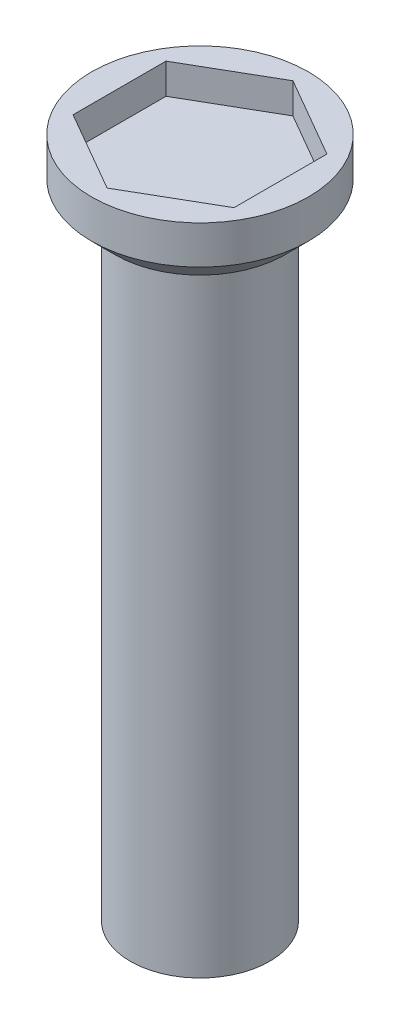
ISO-10303-21;
HEADER;
FILE_DESCRIPTION(('STEP AP214'),'2;1');
FILE_NAME('part.step','',(''),(''),'','','');
FILE_SCHEMA(('AUTOMOTIVE_DESIGN { 1 0 10303 214 1 1 1 1 }'));
ENDSEC;
DATA;
#1=APPLICATION_CONTEXT('core data for automotive mechanical design processes');
#2=APPLICATION_PROTOCOL_DEFINITION('international standard','automotive_design',2000,#1);
#3=PRODUCT_CONTEXT('',#1,'mechanical');
#4=PRODUCT('Part','Part','',(#3));
#5=PRODUCT_RELATED_PRODUCT_CATEGORY('part','',(#4));
#6=PRODUCT_DEFINITION_FORMATION('','',#4);
#7=PRODUCT_DEFINITION_CONTEXT('part definition',#1,'design');
#8=PRODUCT_DEFINITION('design','',#6,#7);
#9=PRODUCT_DEFINITION_SHAPE('','',#8);
#10=(LENGTH_UNIT() NAMED_UNIT(*) SI_UNIT(.MILLI.,.METRE.));
#11=(NAMED_UNIT(*) PLANE_ANGLE_UNIT() SI_UNIT($,.RADIAN.));
#12=(NAMED_UNIT(*) SI_UNIT($,.STERADIAN.) SOLID_ANGLE_UNIT());
#13=UNCERTAINTY_MEASURE_WITH_UNIT(LENGTH_MEASURE(1.E-05),#10,'distance_accuracy_value','');
#14=(GEOMETRIC_REPRESENTATION_CONTEXT(3) GLOBAL_UNCERTAINTY_ASSIGNED_CONTEXT((#13)) GLOBAL_UNIT_ASSIGNED_CONTEXT((#10,
#11,#12)) REPRESENTATION_CONTEXT('',''));
#15=CARTESIAN_POINT('',(0.,0.,0.));
#16=DIRECTION('',(0.,0.,1.));
#17=DIRECTION('',(1.,0.,0.));
#18=AXIS2_PLACEMENT_3D('',#15,#16,#17);
#19=CARTESIAN_POINT('',(0.,20.,0.));
#20=DIRECTION('',(0.,-1.,0.));
#21=DIRECTION('',(0.,0.,-1.));
#22=AXIS2_PLACEMENT_3D('',#19,#20,#21);
#23=CYLINDRICAL_SURFACE('',#22,2.25);
#24=CARTESIAN_POINT('',(0.,20.,0.));
#25=DIRECTION('',(0.,1.,0.));
#26=DIRECTION('',(0.,0.,1.));
#27=AXIS2_PLACEMENT_3D('',#24,#25,#26);
#28=CIRCLE('',#27,2.25);
#29=CARTESIAN_POINT('',(0.,20.,2.25));
#30=VERTEX_POINT('',#29);
#31=EDGE_CURVE('E153',#30,#30,#28,.T.);
#32=ORIENTED_EDGE('',*,*,#31,.F.);
#33=EDGE_LOOP('',(#32));
#34=FACE_BOUND('',#33,.T.);
#35=CARTESIAN_POINT('',(0.,0.,0.));
#36=DIRECTION('',(0.,1.,0.));
#37=DIRECTION('',(0.,0.,1.));
#38=AXIS2_PLACEMENT_3D('',#35,#36,#37);
#39=CIRCLE('',#38,2.25);
#40=CARTESIAN_POINT('',(0.,0.,2.25));
#41=VERTEX_POINT('',#40);
#42=EDGE_CURVE('E152',#41,#41,#39,.T.);
#43=ORIENTED_EDGE('',*,*,#42,.T.);
#44=EDGE_LOOP('',(#43));
#45=FACE_BOUND('',#44,.T.);
#46=ADVANCED_FACE('F41',(#34,#45),#23,.T.);
#47=CARTESIAN_POINT('',(0.,0.,0.));
#48=DIRECTION('',(0.,1.,0.));
#49=DIRECTION('',(0.,0.,1.));
#50=AXIS2_PLACEMENT_3D('',#47,#48,#49);
#51=PLANE('',#50);
#52=ORIENTED_EDGE('',*,*,#42,.F.);
#53=EDGE_LOOP('',(#52));
#54=FACE_BOUND('',#53,.T.);
#55=ADVANCED_FACE('F179',(#54),#51,.F.);
#56=CARTESIAN_POINT('',(0.,22.,0.));
#57=DIRECTION('',(0.,-1.,0.));
#58=DIRECTION('',(0.,0.,-1.));
#59=AXIS2_PLACEMENT_3D('',#56,#57,#58);
#60=CYLINDRICAL_SURFACE('',#59,3.5);
#61=CARTESIAN_POINT('',(0.,20.762,0.));
#62=DIRECTION('',(0.,1.,0.));
#63=DIRECTION('',(0.,0.,1.));
#64=AXIS2_PLACEMENT_3D('',#61,#62,#63);
#65=CIRCLE('',#64,3.5);
#66=CARTESIAN_POINT('',(0.,20.762,3.5));
#67=VERTEX_POINT('',#66);
#68=EDGE_CURVE('E50',#67,#67,#65,.T.);
#69=ORIENTED_EDGE('',*,*,#68,.T.);
#70=EDGE_LOOP('',(#69));
#71=FACE_BOUND('',#70,.T.);
#72=CARTESIAN_POINT('',(0.,22.,0.));
#73=DIRECTION('',(0.,1.,0.));
#74=DIRECTION('',(0.,0.,1.));
#75=AXIS2_PLACEMENT_3D('',#72,#73,#74);
#76=CIRCLE('',#75,3.5);
#77=CARTESIAN_POINT('',(0.,22.,3.5));
#78=VERTEX_POINT('',#77);
#79=EDGE_CURVE('E144',#78,#78,#76,.T.);
#80=ORIENTED_EDGE('',*,*,#79,.F.);
#81=EDGE_LOOP('',(#80));
#82=FACE_BOUND('',#81,.T.);
#83=ADVANCED_FACE('F160',(#71,#82),#60,.T.);
#84=CARTESIAN_POINT('',(0.,22.,0.));
#85=DIRECTION('',(0.,1.,0.));
#86=DIRECTION('',(0.,0.,1.));
#87=AXIS2_PLACEMENT_3D('',#84,#85,#86);
#88=PLANE('',#87);
#89=DIRECTION('',(-0.866025403784439,0.,-0.5));
#90=VECTOR('',#89,1.);
#91=CARTESIAN_POINT('',(2.59807621135332,22.,-1.5));
#92=LINE('',#91,#90);
#93=CARTESIAN_POINT('',(2.59807621135332,22.,-1.5));
#94=VERTEX_POINT('',#93);
#95=CARTESIAN_POINT('',(0.,22.,-3.));
#96=VERTEX_POINT('',#95);
#97=EDGE_CURVE('E57',#94,#96,#92,.T.);
#98=ORIENTED_EDGE('',*,*,#97,.F.);
#99=DIRECTION('',(0.,0.,-1.));
#100=VECTOR('',#99,1.);
#101=CARTESIAN_POINT('',(2.59807621135332,22.,1.5));
#102=LINE('',#101,#100);
#103=CARTESIAN_POINT('',(2.59807621135332,22.,1.5));
#104=VERTEX_POINT('',#103);
#105=EDGE_CURVE('E140',#104,#94,#102,.T.);
#106=ORIENTED_EDGE('',*,*,#105,.F.);
#107=DIRECTION('',(0.866025403784439,0.,-0.5));
#108=VECTOR('',#107,1.);
#109=CARTESIAN_POINT('',(0.,22.,3.));
#110=LINE('',#109,#108);
#111=CARTESIAN_POINT('',(0.,22.,3.));
#112=VERTEX_POINT('',#111);
#113=EDGE_CURVE('E138',#112,#104,#110,.T.);
#114=ORIENTED_EDGE('',*,*,#113,.F.);
#115=DIRECTION('',(0.866025403784439,0.,0.5));
#116=VECTOR('',#115,1.);
#117=CARTESIAN_POINT('',(-2.59807621135332,22.,1.5));
#118=LINE('',#117,#116);
#119=CARTESIAN_POINT('',(-2.59807621135332,22.,1.5));
#120=VERTEX_POINT('',#119);
#121=EDGE_CURVE('E105',#120,#112,#118,.T.);
#122=ORIENTED_EDGE('',*,*,#121,.F.);
#123=DIRECTION('',(0.,0.,1.));
#124=VECTOR('',#123,1.);
#125=CARTESIAN_POINT('',(-2.59807621135332,22.,-1.5));
#126=LINE('',#125,#124);
#127=CARTESIAN_POINT('',(-2.59807621135332,22.,-1.5));
#128=VERTEX_POINT('',#127);
#129=EDGE_CURVE('E134',#128,#120,#126,.T.);
#130=ORIENTED_EDGE('',*,*,#129,.F.);
#131=DIRECTION('',(-0.866025403784439,0.,0.5));
#132=VECTOR('',#131,1.);
#133=CARTESIAN_POINT('',(0.,22.,-3.));
#134=LINE('',#133,#132);
#135=EDGE_CURVE('E131',#96,#128,#134,.T.);
#136=ORIENTED_EDGE('',*,*,#135,.F.);
#137=EDGE_LOOP('',(#98,#106,#114,#122,#130,#136));
#138=FACE_BOUND('',#137,.T.);
#139=ORIENTED_EDGE('',*,*,#79,.T.);
#140=EDGE_LOOP('',(#139));
#141=FACE_BOUND('',#140,.T.);
#142=ADVANCED_FACE('F174',(#138,#141),#88,.T.);
#143=CARTESIAN_POINT('',(0.,20.,0.));
#144=DIRECTION('',(0.,1.,0.));
#145=DIRECTION('',(0.,0.,1.));
#146=AXIS2_PLACEMENT_3D('',#143,#144,#145);
#147=PLANE('',#146);
#148=CARTESIAN_POINT('',(0.,20.,0.));
#149=DIRECTION('',(0.,1.,0.));
#150=DIRECTION('',(0.,0.,1.));
#151=AXIS2_PLACEMENT_3D('',#148,#149,#150);
#152=CIRCLE('',#151,2.738);
#153=CARTESIAN_POINT('',(0.,20.,2.738));
#154=VERTEX_POINT('',#153);
#155=EDGE_CURVE('E11',#154,#154,#152,.F.);
#156=ORIENTED_EDGE('',*,*,#155,.T.);
#157=EDGE_LOOP('',(#156));
#158=FACE_BOUND('',#157,.T.);
#159=ORIENTED_EDGE('',*,*,#31,.T.);
#160=EDGE_LOOP('',(#159));
#161=FACE_BOUND('',#160,.T.);
#162=ADVANCED_FACE('F165',(#158,#161),#147,.F.);
#163=CARTESIAN_POINT('',(0.,20.762,0.));
#164=DIRECTION('',(0.,1.,0.));
#165=DIRECTION('',(0.,0.,1.));
#166=AXIS2_PLACEMENT_3D('',#163,#164,#165);
#167=CONICAL_SURFACE('',#166,3.5,0.785398163397448);
#168=ORIENTED_EDGE('',*,*,#155,.F.);
#169=EDGE_LOOP('',(#168));
#170=FACE_BOUND('',#169,.T.);
#171=ORIENTED_EDGE('',*,*,#68,.F.);
#172=EDGE_LOOP('',(#171));
#173=FACE_BOUND('',#172,.T.);
#174=ADVANCED_FACE('F44',(#170,#173),#167,.T.);
#175=CARTESIAN_POINT('',(2.59807621135332,21.016,-1.5));
#176=DIRECTION('',(0.5,0.,-0.866025403784439));
#177=DIRECTION('',(-0.866025403784439,0.,-0.5));
#178=AXIS2_PLACEMENT_3D('',#175,#176,#177);
#179=PLANE('',#178);
#180=ORIENTED_EDGE('',*,*,#97,.T.);
#181=DIRECTION('',(0.,1.,0.));
#182=VECTOR('',#181,1.);
#183=CARTESIAN_POINT('',(0.,21.016,-3.));
#184=LINE('',#183,#182);
#185=CARTESIAN_POINT('',(0.,21.016,-3.));
#186=VERTEX_POINT('',#185);
#187=EDGE_CURVE('E87',#186,#96,#184,.T.);
#188=ORIENTED_EDGE('',*,*,#187,.F.);
#189=DIRECTION('',(-0.866025403784439,0.,-0.5));
#190=VECTOR('',#189,1.);
#191=CARTESIAN_POINT('',(2.59807621135332,21.016,-1.5));
#192=LINE('',#191,#190);
#193=CARTESIAN_POINT('',(2.59807621135332,21.016,-1.5));
#194=VERTEX_POINT('',#193);
#195=EDGE_CURVE('E142',#194,#186,#192,.T.);
#196=ORIENTED_EDGE('',*,*,#195,.F.);
#197=DIRECTION('',(0.,1.,0.));
#198=VECTOR('',#197,1.);
#199=CARTESIAN_POINT('',(2.59807621135332,21.016,-1.5));
#200=LINE('',#199,#198);
#201=EDGE_CURVE('E65',#194,#94,#200,.T.);
#202=ORIENTED_EDGE('',*,*,#201,.T.);
#203=EDGE_LOOP('',(#180,#188,#196,#202));
#204=FACE_BOUND('',#203,.T.);
#205=ADVANCED_FACE('F164',(#204),#179,.F.);
#206=CARTESIAN_POINT('',(2.59807621135332,21.016,1.5));
#207=DIRECTION('',(1.,0.,0.));
#208=DIRECTION('',(0.,0.,-1.));
#209=AXIS2_PLACEMENT_3D('',#206,#207,#208);
#210=PLANE('',#209);
#211=ORIENTED_EDGE('',*,*,#105,.T.);
#212=ORIENTED_EDGE('',*,*,#201,.F.);
#213=DIRECTION('',(0.,0.,-1.));
#214=VECTOR('',#213,1.);
#215=CARTESIAN_POINT('',(2.59807621135332,21.016,1.5));
#216=LINE('',#215,#214);
#217=CARTESIAN_POINT('',(2.59807621135332,21.016,1.5));
#218=VERTEX_POINT('',#217);
#219=EDGE_CURVE('E117',#218,#194,#216,.T.);
#220=ORIENTED_EDGE('',*,*,#219,.F.);
#221=DIRECTION('',(0.,1.,0.));
#222=VECTOR('',#221,1.);
#223=CARTESIAN_POINT('',(2.59807621135332,21.016,1.5));
#224=LINE('',#223,#222);
#225=EDGE_CURVE('E109',#218,#104,#224,.T.);
#226=ORIENTED_EDGE('',*,*,#225,.T.);
#227=EDGE_LOOP('',(#211,#212,#220,#226));
#228=FACE_BOUND('',#227,.T.);
#229=ADVANCED_FACE('F172',(#228),#210,.F.);
#230=CARTESIAN_POINT('',(0.,21.016,3.));
#231=DIRECTION('',(0.5,0.,0.866025403784438));
#232=DIRECTION('',(0.866025403784439,0.,-0.5));
#233=AXIS2_PLACEMENT_3D('',#230,#231,#232);
#234=PLANE('',#233);
#235=ORIENTED_EDGE('',*,*,#113,.T.);
#236=ORIENTED_EDGE('',*,*,#225,.F.);
#237=DIRECTION('',(0.866025403784439,0.,-0.5));
#238=VECTOR('',#237,1.);
#239=CARTESIAN_POINT('',(0.,21.016,3.));
#240=LINE('',#239,#238);
#241=CARTESIAN_POINT('',(0.,21.016,3.));
#242=VERTEX_POINT('',#241);
#243=EDGE_CURVE('E113',#242,#218,#240,.T.);
#244=ORIENTED_EDGE('',*,*,#243,.F.);
#245=DIRECTION('',(0.,1.,0.));
#246=VECTOR('',#245,1.);
#247=CARTESIAN_POINT('',(0.,21.016,3.));
#248=LINE('',#247,#246);
#249=EDGE_CURVE('E98',#242,#112,#248,.T.);
#250=ORIENTED_EDGE('',*,*,#249,.T.);
#251=EDGE_LOOP('',(#235,#236,#244,#250));
#252=FACE_BOUND('',#251,.T.);
#253=ADVANCED_FACE('F114',(#252),#234,.F.);
#254=CARTESIAN_POINT('',(-2.59807621135332,21.016,1.5));
#255=DIRECTION('',(-0.5,0.,0.866025403784439));
#256=DIRECTION('',(0.866025403784439,0.,0.5));
#257=AXIS2_PLACEMENT_3D('',#254,#255,#256);
#258=PLANE('',#257);
#259=ORIENTED_EDGE('',*,*,#121,.T.);
#260=ORIENTED_EDGE('',*,*,#249,.F.);
#261=DIRECTION('',(0.866025403784439,0.,0.5));
#262=VECTOR('',#261,1.);
#263=CARTESIAN_POINT('',(-2.59807621135332,21.016,1.5));
#264=LINE('',#263,#262);
#265=CARTESIAN_POINT('',(-2.59807621135332,21.016,1.5));
#266=VERTEX_POINT('',#265);
#267=EDGE_CURVE('E102',#266,#242,#264,.T.);
#268=ORIENTED_EDGE('',*,*,#267,.F.);
#269=DIRECTION('',(0.,1.,0.));
#270=VECTOR('',#269,1.);
#271=CARTESIAN_POINT('',(-2.59807621135332,21.016,1.5));
#272=LINE('',#271,#270);
#273=EDGE_CURVE('E110',#266,#120,#272,.T.);
#274=ORIENTED_EDGE('',*,*,#273,.T.);
#275=EDGE_LOOP('',(#259,#260,#268,#274));
#276=FACE_BOUND('',#275,.T.);
#277=ADVANCED_FACE('F100',(#276),#258,.F.);
#278=CARTESIAN_POINT('',(-2.59807621135332,21.016,-1.5));
#279=DIRECTION('',(-1.,0.,0.));
#280=DIRECTION('',(0.,0.,1.));
#281=AXIS2_PLACEMENT_3D('',#278,#279,#280);
#282=PLANE('',#281);
#283=ORIENTED_EDGE('',*,*,#129,.T.);
#284=ORIENTED_EDGE('',*,*,#273,.F.);
#285=DIRECTION('',(0.,0.,1.));
#286=VECTOR('',#285,1.);
#287=CARTESIAN_POINT('',(-2.59807621135332,21.016,-1.5));
#288=LINE('',#287,#286);
#289=CARTESIAN_POINT('',(-2.59807621135332,21.016,-1.5));
#290=VERTEX_POINT('',#289);
#291=EDGE_CURVE('E123',#290,#266,#288,.T.);
#292=ORIENTED_EDGE('',*,*,#291,.F.);
#293=DIRECTION('',(0.,1.,0.));
#294=VECTOR('',#293,1.);
#295=CARTESIAN_POINT('',(-2.59807621135332,21.016,-1.5));
#296=LINE('',#295,#294);
#297=EDGE_CURVE('E147',#290,#128,#296,.T.);
#298=ORIENTED_EDGE('',*,*,#297,.T.);
#299=EDGE_LOOP('',(#283,#284,#292,#298));
#300=FACE_BOUND('',#299,.T.);
#301=ADVANCED_FACE('F196',(#300),#282,.F.);
#302=CARTESIAN_POINT('',(0.,21.016,-3.));
#303=DIRECTION('',(-0.5,0.,-0.866025403784439));
#304=DIRECTION('',(-0.866025403784439,0.,0.5));
#305=AXIS2_PLACEMENT_3D('',#302,#303,#304);
#306=PLANE('',#305);
#307=ORIENTED_EDGE('',*,*,#135,.T.);
#308=ORIENTED_EDGE('',*,*,#297,.F.);
#309=DIRECTION('',(-0.866025403784439,0.,0.5));
#310=VECTOR('',#309,1.);
#311=CARTESIAN_POINT('',(0.,21.016,-3.));
#312=LINE('',#311,#310);
#313=EDGE_CURVE('E125',#186,#290,#312,.T.);
#314=ORIENTED_EDGE('',*,*,#313,.F.);
#315=ORIENTED_EDGE('',*,*,#187,.T.);
#316=EDGE_LOOP('',(#307,#308,#314,#315));
#317=FACE_BOUND('',#316,.T.);
#318=ADVANCED_FACE('F193',(#317),#306,.F.);
#319=CARTESIAN_POINT('',(0.,21.016,0.));
#320=DIRECTION('',(0.,1.,0.));
#321=DIRECTION('',(0.,0.,1.));
#322=AXIS2_PLACEMENT_3D('',#319,#320,#321);
#323=PLANE('',#322);
#324=ORIENTED_EDGE('',*,*,#195,.T.);
#325=ORIENTED_EDGE('',*,*,#313,.T.);
#326=ORIENTED_EDGE('',*,*,#291,.T.);
#327=ORIENTED_EDGE('',*,*,#267,.T.);
#328=ORIENTED_EDGE('',*,*,#243,.T.);
#329=ORIENTED_EDGE('',*,*,#219,.T.);
#330=EDGE_LOOP('',(#324,#325,#326,#327,#328,#329));
#331=FACE_BOUND('',#330,.T.);
#332=ADVANCED_FACE('F120',(#331),#323,.T.);
#333=CLOSED_SHELL('',(#46,#55,#83,#142,#162,#174,#205,#229,#253,#277,#301,#318,#332));
#334=MANIFOLD_SOLID_BREP('B2',#333);
#335=ADVANCED_BREP_SHAPE_REPRESENTATION('',(#18,#334),#14);
#336=SHAPE_DEFINITION_REPRESENTATION(#9,#335);
ENDSEC;
END-ISO-10303-21;
